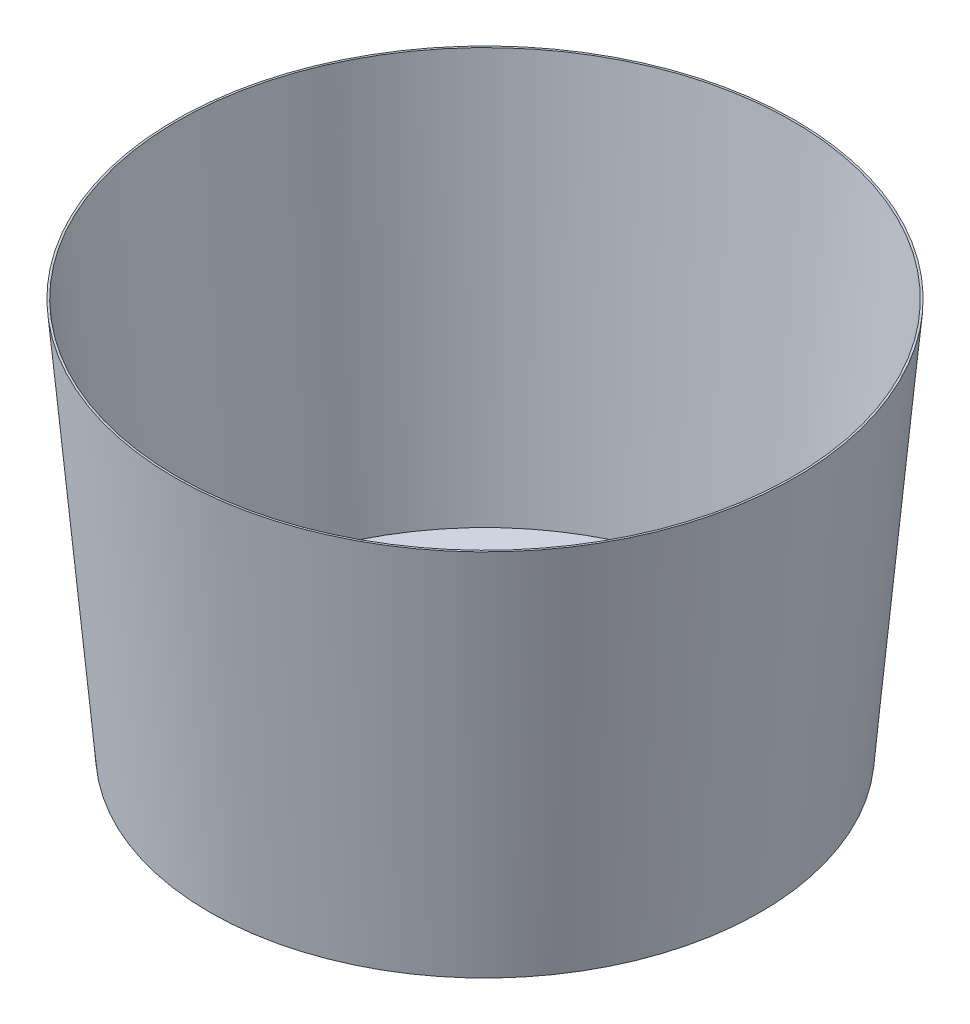
ISO-10303-21;
HEADER;
FILE_DESCRIPTION(('STEP AP214'),'2;1');
FILE_NAME('part.step','',(''),(''),'','','');
FILE_SCHEMA(('AUTOMOTIVE_DESIGN { 1 0 10303 214 1 1 1 1 }'));
ENDSEC;
DATA;
#1=APPLICATION_CONTEXT('core data for automotive mechanical design processes');
#2=APPLICATION_PROTOCOL_DEFINITION('international standard','automotive_design',2000,#1);
#3=PRODUCT_CONTEXT('',#1,'mechanical');
#4=PRODUCT('Part','Part','',(#3));
#5=PRODUCT_RELATED_PRODUCT_CATEGORY('part','',(#4));
#6=PRODUCT_DEFINITION_FORMATION('','',#4);
#7=PRODUCT_DEFINITION_CONTEXT('part definition',#1,'design');
#8=PRODUCT_DEFINITION('design','',#6,#7);
#9=PRODUCT_DEFINITION_SHAPE('','',#8);
#10=(LENGTH_UNIT() NAMED_UNIT(*) SI_UNIT(.MILLI.,.METRE.));
#11=(NAMED_UNIT(*) PLANE_ANGLE_UNIT() SI_UNIT($,.RADIAN.));
#12=(NAMED_UNIT(*) SI_UNIT($,.STERADIAN.) SOLID_ANGLE_UNIT());
#13=UNCERTAINTY_MEASURE_WITH_UNIT(LENGTH_MEASURE(1.E-05),#10,'distance_accuracy_value','');
#14=(GEOMETRIC_REPRESENTATION_CONTEXT(3) GLOBAL_UNCERTAINTY_ASSIGNED_CONTEXT((#13)) GLOBAL_UNIT_ASSIGNED_CONTEXT((#10,
#11,#12)) REPRESENTATION_CONTEXT('',''));
#15=CARTESIAN_POINT('',(0.,0.,0.));
#16=DIRECTION('',(0.,0.,1.));
#17=DIRECTION('',(1.,0.,0.));
#18=AXIS2_PLACEMENT_3D('',#15,#16,#17);
#19=CARTESIAN_POINT('',(0.,0.,0.));
#20=DIRECTION('',(0.,1.,0.));
#21=DIRECTION('',(0.,0.,1.));
#22=AXIS2_PLACEMENT_3D('',#19,#20,#21);
#23=CONICAL_SURFACE('',#22,35.56,0.0872664625997167);
#24=CARTESIAN_POINT('',(0.,50.8,0.));
#25=DIRECTION('',(0.,1.,0.));
#26=DIRECTION('',(0.,0.,1.));
#27=AXIS2_PLACEMENT_3D('',#24,#25,#26);
#28=CIRCLE('',#27,40.0044241071169);
#29=CARTESIAN_POINT('',(0.,50.8,40.0044241071169));
#30=VERTEX_POINT('',#29);
#31=EDGE_CURVE('E11',#30,#30,#28,.T.);
#32=ORIENTED_EDGE('',*,*,#31,.F.);
#33=EDGE_LOOP('',(#32));
#34=FACE_BOUND('',#33,.T.);
#35=CARTESIAN_POINT('',(0.,0.,0.));
#36=DIRECTION('',(0.,1.,0.));
#37=DIRECTION('',(0.,0.,1.));
#38=AXIS2_PLACEMENT_3D('',#35,#36,#37);
#39=CIRCLE('',#38,35.56);
#40=CARTESIAN_POINT('',(0.,0.,35.56));
#41=VERTEX_POINT('',#40);
#42=EDGE_CURVE('E45',#41,#41,#39,.T.);
#43=ORIENTED_EDGE('',*,*,#42,.T.);
#44=EDGE_LOOP('',(#43));
#45=FACE_BOUND('',#44,.T.);
#46=ADVANCED_FACE('F39',(#34,#45),#23,.T.);
#47=CARTESIAN_POINT('',(0.,50.8,0.));
#48=DIRECTION('',(0.,1.,0.));
#49=DIRECTION('',(0.,0.,1.));
#50=AXIS2_PLACEMENT_3D('',#47,#48,#49);
#51=PLANE('',#50);
#52=CARTESIAN_POINT('',(0.,50.8,0.));
#53=DIRECTION('',(0.,1.,0.));
#54=DIRECTION('',(0.,0.,1.));
#55=AXIS2_PLACEMENT_3D('',#52,#53,#54);
#56=CIRCLE('',#55,39.7504241071169);
#57=CARTESIAN_POINT('',(0.,50.8,39.7504241071169));
#58=VERTEX_POINT('',#57);
#59=EDGE_CURVE('E53',#58,#58,#56,.T.);
#60=ORIENTED_EDGE('',*,*,#59,.F.);
#61=EDGE_LOOP('',(#60));
#62=FACE_BOUND('',#61,.T.);
#63=ORIENTED_EDGE('',*,*,#31,.T.);
#64=EDGE_LOOP('',(#63));
#65=FACE_BOUND('',#64,.T.);
#66=ADVANCED_FACE('F61',(#62,#65),#51,.T.);
#67=CARTESIAN_POINT('',(0.,0.,0.));
#68=DIRECTION('',(0.,1.,0.));
#69=DIRECTION('',(0.,0.,1.));
#70=AXIS2_PLACEMENT_3D('',#67,#68,#69);
#71=PLANE('',#70);
#72=ORIENTED_EDGE('',*,*,#42,.F.);
#73=EDGE_LOOP('',(#72));
#74=FACE_BOUND('',#73,.T.);
#75=ADVANCED_FACE('F63',(#74),#71,.F.);
#76=CARTESIAN_POINT('',(0.,50.8,0.));
#77=DIRECTION('',(0.,1.,0.));
#78=DIRECTION('',(0.,0.,1.));
#79=AXIS2_PLACEMENT_3D('',#76,#77,#78);
#80=CONICAL_SURFACE('',#79,39.7504241071169,0.0872664625997167);
#81=CARTESIAN_POINT('',(0.,0.253999999999997,0.));
#82=DIRECTION('',(0.,1.,0.));
#83=DIRECTION('',(0.,0.,1.));
#84=AXIS2_PLACEMENT_3D('',#81,#82,#83);
#85=CIRCLE('',#84,35.3282221205356);
#86=CARTESIAN_POINT('',(0.,0.253999999999997,35.3282221205356));
#87=VERTEX_POINT('',#86);
#88=EDGE_CURVE('E49',#87,#87,#85,.F.);
#89=ORIENTED_EDGE('',*,*,#88,.T.);
#90=EDGE_LOOP('',(#89));
#91=FACE_BOUND('',#90,.T.);
#92=ORIENTED_EDGE('',*,*,#59,.T.);
#93=EDGE_LOOP('',(#92));
#94=FACE_BOUND('',#93,.T.);
#95=ADVANCED_FACE('F59',(#91,#94),#80,.F.);
#96=CARTESIAN_POINT('',(0.,0.254,0.));
#97=DIRECTION('',(0.,1.,0.));
#98=DIRECTION('',(0.,0.,1.));
#99=AXIS2_PLACEMENT_3D('',#96,#97,#98);
#100=PLANE('',#99);
#101=ORIENTED_EDGE('',*,*,#88,.F.);
#102=EDGE_LOOP('',(#101));
#103=FACE_BOUND('',#102,.T.);
#104=ADVANCED_FACE('F74',(#103),#100,.T.);
#105=CLOSED_SHELL('',(#46,#66,#75,#95,#104));
#106=MANIFOLD_SOLID_BREP('B2',#105);
#107=ADVANCED_BREP_SHAPE_REPRESENTATION('',(#18,#106),#14);
#108=SHAPE_DEFINITION_REPRESENTATION(#9,#107);
ENDSEC;
END-ISO-10303-21;
